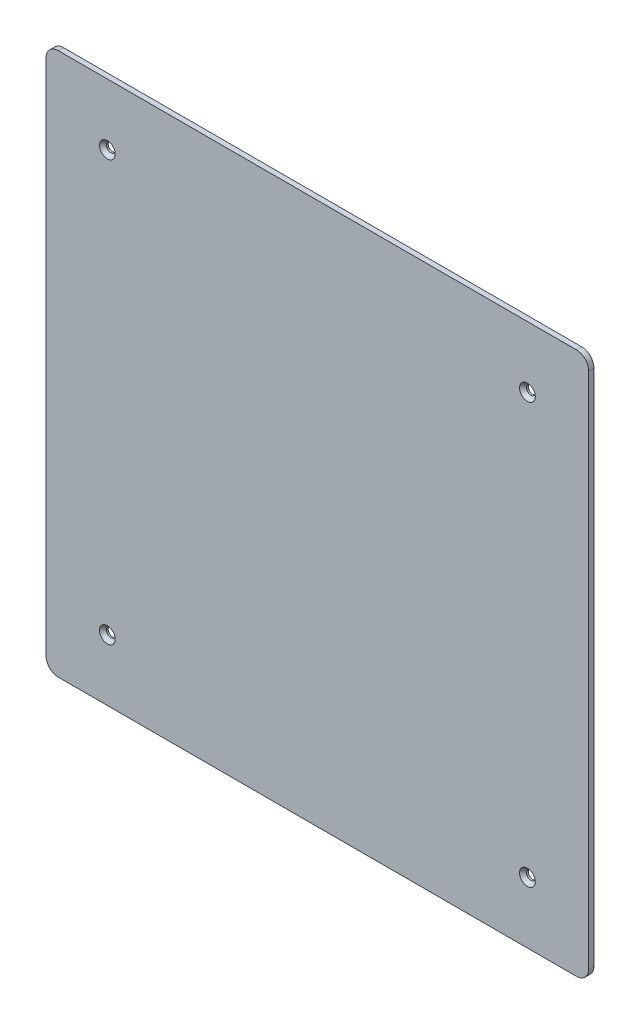
ISO-10303-21;
HEADER;
FILE_DESCRIPTION(('STEP AP214'),'2;1');
FILE_NAME('part.step','',(''),(''),'','','');
FILE_SCHEMA(('AUTOMOTIVE_DESIGN { 1 0 10303 214 1 1 1 1 }'));
ENDSEC;
DATA;
#1=APPLICATION_CONTEXT('core data for automotive mechanical design processes');
#2=APPLICATION_PROTOCOL_DEFINITION('international standard','automotive_design',2000,#1);
#3=PRODUCT_CONTEXT('',#1,'mechanical');
#4=PRODUCT('Part','Part','',(#3));
#5=PRODUCT_RELATED_PRODUCT_CATEGORY('part','',(#4));
#6=PRODUCT_DEFINITION_FORMATION('','',#4);
#7=PRODUCT_DEFINITION_CONTEXT('part definition',#1,'design');
#8=PRODUCT_DEFINITION('design','',#6,#7);
#9=PRODUCT_DEFINITION_SHAPE('','',#8);
#10=(LENGTH_UNIT() NAMED_UNIT(*) SI_UNIT(.MILLI.,.METRE.));
#11=(NAMED_UNIT(*) PLANE_ANGLE_UNIT() SI_UNIT($,.RADIAN.));
#12=(NAMED_UNIT(*) SI_UNIT($,.STERADIAN.) SOLID_ANGLE_UNIT());
#13=UNCERTAINTY_MEASURE_WITH_UNIT(LENGTH_MEASURE(1.E-05),#10,'distance_accuracy_value','');
#14=(GEOMETRIC_REPRESENTATION_CONTEXT(3) GLOBAL_UNCERTAINTY_ASSIGNED_CONTEXT((#13)) GLOBAL_UNIT_ASSIGNED_CONTEXT((#10,
#11,#12)) REPRESENTATION_CONTEXT('',''));
#15=CARTESIAN_POINT('',(0.,0.,0.));
#16=DIRECTION('',(0.,0.,1.));
#17=DIRECTION('',(1.,0.,0.));
#18=AXIS2_PLACEMENT_3D('',#15,#16,#17);
#19=CARTESIAN_POINT('',(-155.,155.,3.));
#20=DIRECTION('',(0.,-1.,0.));
#21=DIRECTION('',(1.,0.,0.));
#22=AXIS2_PLACEMENT_3D('',#19,#20,#21);
#23=PLANE('',#22);
#24=DIRECTION('',(-1.,0.,0.));
#25=VECTOR('',#24,1.);
#26=CARTESIAN_POINT('',(-155.,155.,0.));
#27=LINE('',#26,#25);
#28=CARTESIAN_POINT('',(148.,155.,0.));
#29=VERTEX_POINT('',#28);
#30=CARTESIAN_POINT('',(-148.,155.,0.));
#31=VERTEX_POINT('',#30);
#32=EDGE_CURVE('E274',#29,#31,#27,.T.);
#33=ORIENTED_EDGE('',*,*,#32,.T.);
#34=DIRECTION('',(0.,0.,-1.));
#35=VECTOR('',#34,1.);
#36=CARTESIAN_POINT('',(-148.,155.,3.));
#37=LINE('',#36,#35);
#38=CARTESIAN_POINT('',(-148.,155.,3.));
#39=VERTEX_POINT('',#38);
#40=EDGE_CURVE('E172',#31,#39,#37,.F.);
#41=ORIENTED_EDGE('',*,*,#40,.T.);
#42=DIRECTION('',(-1.,0.,0.));
#43=VECTOR('',#42,1.);
#44=CARTESIAN_POINT('',(-155.,155.,3.));
#45=LINE('',#44,#43);
#46=CARTESIAN_POINT('',(148.,155.,3.));
#47=VERTEX_POINT('',#46);
#48=EDGE_CURVE('E141',#47,#39,#45,.T.);
#49=ORIENTED_EDGE('',*,*,#48,.F.);
#50=DIRECTION('',(0.,0.,-1.));
#51=VECTOR('',#50,1.);
#52=CARTESIAN_POINT('',(148.,155.,3.));
#53=LINE('',#52,#51);
#54=EDGE_CURVE('E169',#47,#29,#53,.T.);
#55=ORIENTED_EDGE('',*,*,#54,.T.);
#56=EDGE_LOOP('',(#33,#41,#49,#55));
#57=FACE_BOUND('',#56,.T.);
#58=ADVANCED_FACE('F47',(#57),#23,.F.);
#59=CARTESIAN_POINT('',(-155.,-155.,3.));
#60=DIRECTION('',(1.,0.,0.));
#61=DIRECTION('',(0.,0.,-1.));
#62=AXIS2_PLACEMENT_3D('',#59,#60,#61);
#63=PLANE('',#62);
#64=DIRECTION('',(0.,-1.,0.));
#65=VECTOR('',#64,1.);
#66=CARTESIAN_POINT('',(-155.,-155.,0.));
#67=LINE('',#66,#65);
#68=CARTESIAN_POINT('',(-155.,148.,0.));
#69=VERTEX_POINT('',#68);
#70=CARTESIAN_POINT('',(-155.,-148.,0.));
#71=VERTEX_POINT('',#70);
#72=EDGE_CURVE('E146',#69,#71,#67,.T.);
#73=ORIENTED_EDGE('',*,*,#72,.T.);
#74=DIRECTION('',(0.,0.,-1.));
#75=VECTOR('',#74,1.);
#76=CARTESIAN_POINT('',(-155.,-148.,3.));
#77=LINE('',#76,#75);
#78=CARTESIAN_POINT('',(-155.,-148.,3.));
#79=VERTEX_POINT('',#78);
#80=EDGE_CURVE('E63',#71,#79,#77,.F.);
#81=ORIENTED_EDGE('',*,*,#80,.T.);
#82=DIRECTION('',(0.,-1.,0.));
#83=VECTOR('',#82,1.);
#84=CARTESIAN_POINT('',(-155.,-155.,3.));
#85=LINE('',#84,#83);
#86=CARTESIAN_POINT('',(-155.,148.,3.));
#87=VERTEX_POINT('',#86);
#88=EDGE_CURVE('E144',#87,#79,#85,.T.);
#89=ORIENTED_EDGE('',*,*,#88,.F.);
#90=DIRECTION('',(0.,0.,-1.));
#91=VECTOR('',#90,1.);
#92=CARTESIAN_POINT('',(-155.,148.,3.));
#93=LINE('',#92,#91);
#94=EDGE_CURVE('E165',#87,#69,#93,.T.);
#95=ORIENTED_EDGE('',*,*,#94,.T.);
#96=EDGE_LOOP('',(#73,#81,#89,#95));
#97=FACE_BOUND('',#96,.T.);
#98=ADVANCED_FACE('F212',(#97),#63,.F.);
#99=CARTESIAN_POINT('',(-155.,-155.,3.));
#100=DIRECTION('',(0.,1.,0.));
#101=DIRECTION('',(-1.,0.,0.));
#102=AXIS2_PLACEMENT_3D('',#99,#100,#101);
#103=PLANE('',#102);
#104=DIRECTION('',(1.,0.,0.));
#105=VECTOR('',#104,1.);
#106=CARTESIAN_POINT('',(-155.,-155.,0.));
#107=LINE('',#106,#105);
#108=CARTESIAN_POINT('',(-148.,-155.,0.));
#109=VERTEX_POINT('',#108);
#110=CARTESIAN_POINT('',(148.,-155.,0.));
#111=VERTEX_POINT('',#110);
#112=EDGE_CURVE('E142',#109,#111,#107,.T.);
#113=ORIENTED_EDGE('',*,*,#112,.T.);
#114=DIRECTION('',(0.,0.,-1.));
#115=VECTOR('',#114,1.);
#116=CARTESIAN_POINT('',(148.,-155.,3.));
#117=LINE('',#116,#115);
#118=CARTESIAN_POINT('',(148.,-155.,3.));
#119=VERTEX_POINT('',#118);
#120=EDGE_CURVE('E120',#111,#119,#117,.F.);
#121=ORIENTED_EDGE('',*,*,#120,.T.);
#122=DIRECTION('',(1.,0.,0.));
#123=VECTOR('',#122,1.);
#124=CARTESIAN_POINT('',(-155.,-155.,3.));
#125=LINE('',#124,#123);
#126=CARTESIAN_POINT('',(-148.,-155.,3.));
#127=VERTEX_POINT('',#126);
#128=EDGE_CURVE('E277',#127,#119,#125,.T.);
#129=ORIENTED_EDGE('',*,*,#128,.F.);
#130=DIRECTION('',(0.,0.,-1.));
#131=VECTOR('',#130,1.);
#132=CARTESIAN_POINT('',(-148.,-155.,3.));
#133=LINE('',#132,#131);
#134=EDGE_CURVE('E125',#127,#109,#133,.T.);
#135=ORIENTED_EDGE('',*,*,#134,.T.);
#136=EDGE_LOOP('',(#113,#121,#129,#135));
#137=FACE_BOUND('',#136,.T.);
#138=ADVANCED_FACE('F218',(#137),#103,.F.);
#139=CARTESIAN_POINT('',(155.,-155.,3.));
#140=DIRECTION('',(-1.,0.,0.));
#141=DIRECTION('',(0.,0.,1.));
#142=AXIS2_PLACEMENT_3D('',#139,#140,#141);
#143=PLANE('',#142);
#144=DIRECTION('',(0.,1.,0.));
#145=VECTOR('',#144,1.);
#146=CARTESIAN_POINT('',(155.,-155.,3.));
#147=LINE('',#146,#145);
#148=CARTESIAN_POINT('',(155.,-148.,3.));
#149=VERTEX_POINT('',#148);
#150=CARTESIAN_POINT('',(155.,148.,3.));
#151=VERTEX_POINT('',#150);
#152=EDGE_CURVE('E135',#149,#151,#147,.T.);
#153=ORIENTED_EDGE('',*,*,#152,.F.);
#154=DIRECTION('',(0.,0.,-1.));
#155=VECTOR('',#154,1.);
#156=CARTESIAN_POINT('',(155.,-148.,3.));
#157=LINE('',#156,#155);
#158=CARTESIAN_POINT('',(155.,-148.,0.));
#159=VERTEX_POINT('',#158);
#160=EDGE_CURVE('E119',#149,#159,#157,.T.);
#161=ORIENTED_EDGE('',*,*,#160,.T.);
#162=DIRECTION('',(0.,1.,0.));
#163=VECTOR('',#162,1.);
#164=CARTESIAN_POINT('',(155.,-155.,0.));
#165=LINE('',#164,#163);
#166=CARTESIAN_POINT('',(155.,148.,0.));
#167=VERTEX_POINT('',#166);
#168=EDGE_CURVE('E132',#159,#167,#165,.T.);
#169=ORIENTED_EDGE('',*,*,#168,.T.);
#170=DIRECTION('',(0.,0.,-1.));
#171=VECTOR('',#170,1.);
#172=CARTESIAN_POINT('',(155.,148.,3.));
#173=LINE('',#172,#171);
#174=EDGE_CURVE('E137',#167,#151,#173,.F.);
#175=ORIENTED_EDGE('',*,*,#174,.T.);
#176=EDGE_LOOP('',(#153,#161,#169,#175));
#177=FACE_BOUND('',#176,.T.);
#178=ADVANCED_FACE('F131',(#177),#143,.F.);
#179=CARTESIAN_POINT('',(0.,0.,3.));
#180=DIRECTION('',(0.,0.,1.));
#181=DIRECTION('',(1.,0.,0.));
#182=AXIS2_PLACEMENT_3D('',#179,#180,#181);
#183=PLANE('',#182);
#184=CARTESIAN_POINT('',(-120.,-120.,3.));
#185=DIRECTION('',(0.,0.,1.));
#186=DIRECTION('',(1.,0.,0.));
#187=AXIS2_PLACEMENT_3D('',#184,#185,#186);
#188=CIRCLE('',#187,4.50000000000013);
#189=CARTESIAN_POINT('',(-115.5,-120.,3.));
#190=VERTEX_POINT('',#189);
#191=EDGE_CURVE('E186',#190,#190,#188,.F.);
#192=ORIENTED_EDGE('',*,*,#191,.T.);
#193=EDGE_LOOP('',(#192));
#194=FACE_BOUND('',#193,.T.);
#195=CARTESIAN_POINT('',(120.,-120.,3.));
#196=DIRECTION('',(0.,0.,1.));
#197=DIRECTION('',(1.,0.,0.));
#198=AXIS2_PLACEMENT_3D('',#195,#196,#197);
#199=CIRCLE('',#198,4.50000000000002);
#200=CARTESIAN_POINT('',(124.5,-120.,3.));
#201=VERTEX_POINT('',#200);
#202=EDGE_CURVE('E183',#201,#201,#199,.F.);
#203=ORIENTED_EDGE('',*,*,#202,.T.);
#204=EDGE_LOOP('',(#203));
#205=FACE_BOUND('',#204,.T.);
#206=CARTESIAN_POINT('',(120.,120.,3.));
#207=DIRECTION('',(0.,0.,1.));
#208=DIRECTION('',(1.,0.,0.));
#209=AXIS2_PLACEMENT_3D('',#206,#207,#208);
#210=CIRCLE('',#209,4.50000000000002);
#211=CARTESIAN_POINT('',(124.5,120.,3.));
#212=VERTEX_POINT('',#211);
#213=EDGE_CURVE('E180',#212,#212,#210,.F.);
#214=ORIENTED_EDGE('',*,*,#213,.T.);
#215=EDGE_LOOP('',(#214));
#216=FACE_BOUND('',#215,.T.);
#217=CARTESIAN_POINT('',(-120.,120.,3.));
#218=DIRECTION('',(0.,0.,1.));
#219=DIRECTION('',(1.,0.,0.));
#220=AXIS2_PLACEMENT_3D('',#217,#218,#219);
#221=CIRCLE('',#220,4.50000000000002);
#222=CARTESIAN_POINT('',(-115.5,120.,3.));
#223=VERTEX_POINT('',#222);
#224=EDGE_CURVE('E177',#223,#223,#221,.F.);
#225=ORIENTED_EDGE('',*,*,#224,.T.);
#226=EDGE_LOOP('',(#225));
#227=FACE_BOUND('',#226,.T.);
#228=ORIENTED_EDGE('',*,*,#128,.T.);
#229=CARTESIAN_POINT('',(148.,-148.,3.));
#230=DIRECTION('',(0.,0.,1.));
#231=DIRECTION('',(1.,0.,0.));
#232=AXIS2_PLACEMENT_3D('',#229,#230,#231);
#233=CIRCLE('',#232,7.);
#234=EDGE_CURVE('E163',#119,#149,#233,.T.);
#235=ORIENTED_EDGE('',*,*,#234,.T.);
#236=ORIENTED_EDGE('',*,*,#152,.T.);
#237=CARTESIAN_POINT('',(148.,148.,3.));
#238=DIRECTION('',(0.,0.,1.));
#239=DIRECTION('',(1.,0.,0.));
#240=AXIS2_PLACEMENT_3D('',#237,#238,#239);
#241=CIRCLE('',#240,7.);
#242=EDGE_CURVE('E158',#151,#47,#241,.T.);
#243=ORIENTED_EDGE('',*,*,#242,.T.);
#244=ORIENTED_EDGE('',*,*,#48,.T.);
#245=CARTESIAN_POINT('',(-148.,148.,3.));
#246=DIRECTION('',(0.,0.,1.));
#247=DIRECTION('',(1.,0.,0.));
#248=AXIS2_PLACEMENT_3D('',#245,#246,#247);
#249=CIRCLE('',#248,7.);
#250=EDGE_CURVE('E70',#39,#87,#249,.T.);
#251=ORIENTED_EDGE('',*,*,#250,.T.);
#252=ORIENTED_EDGE('',*,*,#88,.T.);
#253=CARTESIAN_POINT('',(-148.,-148.,3.));
#254=DIRECTION('',(0.,0.,1.));
#255=DIRECTION('',(1.,0.,0.));
#256=AXIS2_PLACEMENT_3D('',#253,#254,#255);
#257=CIRCLE('',#256,7.);
#258=EDGE_CURVE('E161',#79,#127,#257,.T.);
#259=ORIENTED_EDGE('',*,*,#258,.T.);
#260=EDGE_LOOP('',(#228,#235,#236,#243,#244,#251,#252,#259));
#261=FACE_BOUND('',#260,.T.);
#262=ADVANCED_FACE('F286',(#194,#205,#216,#227,#261),#183,.T.);
#263=CARTESIAN_POINT('',(0.,0.,0.));
#264=DIRECTION('',(0.,0.,1.));
#265=DIRECTION('',(1.,0.,0.));
#266=AXIS2_PLACEMENT_3D('',#263,#264,#265);
#267=PLANE('',#266);
#268=CARTESIAN_POINT('',(-120.,-120.,0.));
#269=DIRECTION('',(0.,0.,1.));
#270=DIRECTION('',(1.,0.,0.));
#271=AXIS2_PLACEMENT_3D('',#268,#269,#270);
#272=CIRCLE('',#271,2.50000000000001);
#273=CARTESIAN_POINT('',(-117.5,-120.,0.));
#274=VERTEX_POINT('',#273);
#275=EDGE_CURVE('E263',#274,#274,#272,.T.);
#276=ORIENTED_EDGE('',*,*,#275,.T.);
#277=EDGE_LOOP('',(#276));
#278=FACE_BOUND('',#277,.T.);
#279=CARTESIAN_POINT('',(120.,-120.,0.));
#280=DIRECTION('',(0.,0.,1.));
#281=DIRECTION('',(1.,0.,0.));
#282=AXIS2_PLACEMENT_3D('',#279,#280,#281);
#283=CIRCLE('',#282,2.50000000000001);
#284=CARTESIAN_POINT('',(122.5,-120.,0.));
#285=VERTEX_POINT('',#284);
#286=EDGE_CURVE('E265',#285,#285,#283,.T.);
#287=ORIENTED_EDGE('',*,*,#286,.T.);
#288=EDGE_LOOP('',(#287));
#289=FACE_BOUND('',#288,.T.);
#290=CARTESIAN_POINT('',(120.,120.,0.));
#291=DIRECTION('',(0.,0.,1.));
#292=DIRECTION('',(1.,0.,0.));
#293=AXIS2_PLACEMENT_3D('',#290,#291,#292);
#294=CIRCLE('',#293,2.50000000000001);
#295=CARTESIAN_POINT('',(122.5,120.,0.));
#296=VERTEX_POINT('',#295);
#297=EDGE_CURVE('E268',#296,#296,#294,.T.);
#298=ORIENTED_EDGE('',*,*,#297,.T.);
#299=EDGE_LOOP('',(#298));
#300=FACE_BOUND('',#299,.T.);
#301=CARTESIAN_POINT('',(-120.,120.,0.));
#302=DIRECTION('',(0.,0.,1.));
#303=DIRECTION('',(1.,0.,0.));
#304=AXIS2_PLACEMENT_3D('',#301,#302,#303);
#305=CIRCLE('',#304,2.50000000000001);
#306=CARTESIAN_POINT('',(-117.5,120.,0.));
#307=VERTEX_POINT('',#306);
#308=EDGE_CURVE('E272',#307,#307,#305,.T.);
#309=ORIENTED_EDGE('',*,*,#308,.T.);
#310=EDGE_LOOP('',(#309));
#311=FACE_BOUND('',#310,.T.);
#312=ORIENTED_EDGE('',*,*,#168,.F.);
#313=CARTESIAN_POINT('',(148.,-148.,0.));
#314=DIRECTION('',(0.,0.,1.));
#315=DIRECTION('',(1.,0.,0.));
#316=AXIS2_PLACEMENT_3D('',#313,#314,#315);
#317=CIRCLE('',#316,7.);
#318=EDGE_CURVE('E115',#159,#111,#317,.F.);
#319=ORIENTED_EDGE('',*,*,#318,.T.);
#320=ORIENTED_EDGE('',*,*,#112,.F.);
#321=CARTESIAN_POINT('',(-148.,-148.,0.));
#322=DIRECTION('',(0.,0.,1.));
#323=DIRECTION('',(1.,0.,0.));
#324=AXIS2_PLACEMENT_3D('',#321,#322,#323);
#325=CIRCLE('',#324,7.);
#326=EDGE_CURVE('E126',#109,#71,#325,.F.);
#327=ORIENTED_EDGE('',*,*,#326,.T.);
#328=ORIENTED_EDGE('',*,*,#72,.F.);
#329=CARTESIAN_POINT('',(-148.,148.,0.));
#330=DIRECTION('',(0.,0.,1.));
#331=DIRECTION('',(1.,0.,0.));
#332=AXIS2_PLACEMENT_3D('',#329,#330,#331);
#333=CIRCLE('',#332,7.);
#334=EDGE_CURVE('E152',#69,#31,#333,.F.);
#335=ORIENTED_EDGE('',*,*,#334,.T.);
#336=ORIENTED_EDGE('',*,*,#32,.F.);
#337=CARTESIAN_POINT('',(148.,148.,0.));
#338=DIRECTION('',(0.,0.,1.));
#339=DIRECTION('',(1.,0.,0.));
#340=AXIS2_PLACEMENT_3D('',#337,#338,#339);
#341=CIRCLE('',#340,7.);
#342=EDGE_CURVE('E136',#29,#167,#341,.F.);
#343=ORIENTED_EDGE('',*,*,#342,.T.);
#344=EDGE_LOOP('',(#312,#319,#320,#327,#328,#335,#336,#343));
#345=FACE_BOUND('',#344,.T.);
#346=ADVANCED_FACE('F139',(#278,#289,#300,#311,#345),#267,.F.);
#347=CARTESIAN_POINT('',(148.,-148.,3.));
#348=DIRECTION('',(0.,0.,-1.));
#349=DIRECTION('',(-1.,0.,0.));
#350=AXIS2_PLACEMENT_3D('',#347,#348,#349);
#351=CYLINDRICAL_SURFACE('',#350,7.);
#352=ORIENTED_EDGE('',*,*,#234,.F.);
#353=ORIENTED_EDGE('',*,*,#120,.F.);
#354=ORIENTED_EDGE('',*,*,#318,.F.);
#355=ORIENTED_EDGE('',*,*,#160,.F.);
#356=EDGE_LOOP('',(#352,#353,#354,#355));
#357=FACE_BOUND('',#356,.T.);
#358=ADVANCED_FACE('F118',(#357),#351,.T.);
#359=CARTESIAN_POINT('',(-148.,-148.,3.));
#360=DIRECTION('',(0.,0.,-1.));
#361=DIRECTION('',(-1.,0.,0.));
#362=AXIS2_PLACEMENT_3D('',#359,#360,#361);
#363=CYLINDRICAL_SURFACE('',#362,7.);
#364=ORIENTED_EDGE('',*,*,#258,.F.);
#365=ORIENTED_EDGE('',*,*,#80,.F.);
#366=ORIENTED_EDGE('',*,*,#326,.F.);
#367=ORIENTED_EDGE('',*,*,#134,.F.);
#368=EDGE_LOOP('',(#364,#365,#366,#367));
#369=FACE_BOUND('',#368,.T.);
#370=ADVANCED_FACE('F225',(#369),#363,.T.);
#371=CARTESIAN_POINT('',(-148.,148.,3.));
#372=DIRECTION('',(0.,0.,-1.));
#373=DIRECTION('',(-1.,0.,0.));
#374=AXIS2_PLACEMENT_3D('',#371,#372,#373);
#375=CYLINDRICAL_SURFACE('',#374,7.);
#376=ORIENTED_EDGE('',*,*,#250,.F.);
#377=ORIENTED_EDGE('',*,*,#40,.F.);
#378=ORIENTED_EDGE('',*,*,#334,.F.);
#379=ORIENTED_EDGE('',*,*,#94,.F.);
#380=EDGE_LOOP('',(#376,#377,#378,#379));
#381=FACE_BOUND('',#380,.T.);
#382=ADVANCED_FACE('F228',(#381),#375,.T.);
#383=CARTESIAN_POINT('',(148.,148.,3.));
#384=DIRECTION('',(0.,0.,-1.));
#385=DIRECTION('',(-1.,0.,0.));
#386=AXIS2_PLACEMENT_3D('',#383,#384,#385);
#387=CYLINDRICAL_SURFACE('',#386,7.);
#388=ORIENTED_EDGE('',*,*,#242,.F.);
#389=ORIENTED_EDGE('',*,*,#174,.F.);
#390=ORIENTED_EDGE('',*,*,#342,.F.);
#391=ORIENTED_EDGE('',*,*,#54,.F.);
#392=EDGE_LOOP('',(#388,#389,#390,#391));
#393=FACE_BOUND('',#392,.T.);
#394=ADVANCED_FACE('F232',(#393),#387,.T.);
#395=CARTESIAN_POINT('',(-120.,120.,0.));
#396=DIRECTION('',(0.,0.,1.));
#397=DIRECTION('',(1.,0.,0.));
#398=AXIS2_PLACEMENT_3D('',#395,#396,#397);
#399=CYLINDRICAL_SURFACE('',#398,2.50000000000001);
#400=CARTESIAN_POINT('',(-120.,120.,1.00000000000005));
#401=DIRECTION('',(0.,0.,1.));
#402=DIRECTION('',(1.,0.,0.));
#403=AXIS2_PLACEMENT_3D('',#400,#401,#402);
#404=CIRCLE('',#403,2.50000000000001);
#405=CARTESIAN_POINT('',(-117.5,120.,1.00000000000005));
#406=VERTEX_POINT('',#405);
#407=EDGE_CURVE('E11',#406,#406,#404,.T.);
#408=ORIENTED_EDGE('',*,*,#407,.T.);
#409=EDGE_LOOP('',(#408));
#410=FACE_BOUND('',#409,.T.);
#411=ORIENTED_EDGE('',*,*,#308,.F.);
#412=EDGE_LOOP('',(#411));
#413=FACE_BOUND('',#412,.T.);
#414=ADVANCED_FACE('F236',(#410,#413),#399,.F.);
#415=CARTESIAN_POINT('',(120.,120.,0.));
#416=DIRECTION('',(0.,0.,1.));
#417=DIRECTION('',(1.,0.,0.));
#418=AXIS2_PLACEMENT_3D('',#415,#416,#417);
#419=CYLINDRICAL_SURFACE('',#418,2.50000000000001);
#420=CARTESIAN_POINT('',(120.,120.,1.00000000000005));
#421=DIRECTION('',(0.,0.,1.));
#422=DIRECTION('',(1.,0.,0.));
#423=AXIS2_PLACEMENT_3D('',#420,#421,#422);
#424=CIRCLE('',#423,2.50000000000001);
#425=CARTESIAN_POINT('',(122.5,120.,1.00000000000005));
#426=VERTEX_POINT('',#425);
#427=EDGE_CURVE('E56',#426,#426,#424,.T.);
#428=ORIENTED_EDGE('',*,*,#427,.T.);
#429=EDGE_LOOP('',(#428));
#430=FACE_BOUND('',#429,.T.);
#431=ORIENTED_EDGE('',*,*,#297,.F.);
#432=EDGE_LOOP('',(#431));
#433=FACE_BOUND('',#432,.T.);
#434=ADVANCED_FACE('F194',(#430,#433),#419,.F.);
#435=CARTESIAN_POINT('',(120.,-120.,0.));
#436=DIRECTION('',(0.,0.,1.));
#437=DIRECTION('',(1.,0.,0.));
#438=AXIS2_PLACEMENT_3D('',#435,#436,#437);
#439=CYLINDRICAL_SURFACE('',#438,2.50000000000001);
#440=CARTESIAN_POINT('',(120.,-120.,1.00000000000005));
#441=DIRECTION('',(0.,0.,1.));
#442=DIRECTION('',(1.,0.,0.));
#443=AXIS2_PLACEMENT_3D('',#440,#441,#442);
#444=CIRCLE('',#443,2.50000000000001);
#445=CARTESIAN_POINT('',(122.5,-120.,1.00000000000005));
#446=VERTEX_POINT('',#445);
#447=EDGE_CURVE('E189',#446,#446,#444,.T.);
#448=ORIENTED_EDGE('',*,*,#447,.T.);
#449=EDGE_LOOP('',(#448));
#450=FACE_BOUND('',#449,.T.);
#451=ORIENTED_EDGE('',*,*,#286,.F.);
#452=EDGE_LOOP('',(#451));
#453=FACE_BOUND('',#452,.T.);
#454=ADVANCED_FACE('F254',(#450,#453),#439,.F.);
#455=CARTESIAN_POINT('',(-120.,-120.,0.));
#456=DIRECTION('',(0.,0.,1.));
#457=DIRECTION('',(1.,0.,0.));
#458=AXIS2_PLACEMENT_3D('',#455,#456,#457);
#459=CYLINDRICAL_SURFACE('',#458,2.50000000000001);
#460=CARTESIAN_POINT('',(-120.,-120.,0.999999999999886));
#461=DIRECTION('',(0.,0.,1.));
#462=DIRECTION('',(1.,0.,0.));
#463=AXIS2_PLACEMENT_3D('',#460,#461,#462);
#464=CIRCLE('',#463,2.50000000000001);
#465=CARTESIAN_POINT('',(-117.5,-120.,0.999999999999886));
#466=VERTEX_POINT('',#465);
#467=EDGE_CURVE('E174',#466,#466,#464,.T.);
#468=ORIENTED_EDGE('',*,*,#467,.T.);
#469=EDGE_LOOP('',(#468));
#470=FACE_BOUND('',#469,.T.);
#471=ORIENTED_EDGE('',*,*,#275,.F.);
#472=EDGE_LOOP('',(#471));
#473=FACE_BOUND('',#472,.T.);
#474=ADVANCED_FACE('F243',(#470,#473),#459,.F.);
#475=CARTESIAN_POINT('',(-120.,-120.,0.999999999999886));
#476=DIRECTION('',(0.,0.,1.));
#477=DIRECTION('',(1.,0.,0.));
#478=AXIS2_PLACEMENT_3D('',#475,#476,#477);
#479=CONICAL_SURFACE('',#478,2.50000000000001,0.78539816339745);
#480=ORIENTED_EDGE('',*,*,#191,.F.);
#481=EDGE_LOOP('',(#480));
#482=FACE_BOUND('',#481,.T.);
#483=ORIENTED_EDGE('',*,*,#467,.F.);
#484=EDGE_LOOP('',(#483));
#485=FACE_BOUND('',#484,.T.);
#486=ADVANCED_FACE('F206',(#482,#485),#479,.F.);
#487=CARTESIAN_POINT('',(120.,-120.,1.00000000000005));
#488=DIRECTION('',(0.,0.,1.));
#489=DIRECTION('',(1.,0.,0.));
#490=AXIS2_PLACEMENT_3D('',#487,#488,#489);
#491=CONICAL_SURFACE('',#490,2.50000000000001,0.785398163397463);
#492=ORIENTED_EDGE('',*,*,#202,.F.);
#493=EDGE_LOOP('',(#492));
#494=FACE_BOUND('',#493,.T.);
#495=ORIENTED_EDGE('',*,*,#447,.F.);
#496=EDGE_LOOP('',(#495));
#497=FACE_BOUND('',#496,.T.);
#498=ADVANCED_FACE('F199',(#494,#497),#491,.F.);
#499=CARTESIAN_POINT('',(120.,120.,1.00000000000005));
#500=DIRECTION('',(0.,0.,1.));
#501=DIRECTION('',(1.,0.,0.));
#502=AXIS2_PLACEMENT_3D('',#499,#500,#501);
#503=CONICAL_SURFACE('',#502,2.50000000000001,0.785398163397463);
#504=ORIENTED_EDGE('',*,*,#213,.F.);
#505=EDGE_LOOP('',(#504));
#506=FACE_BOUND('',#505,.T.);
#507=ORIENTED_EDGE('',*,*,#427,.F.);
#508=EDGE_LOOP('',(#507));
#509=FACE_BOUND('',#508,.T.);
#510=ADVANCED_FACE('F197',(#506,#509),#503,.F.);
#511=CARTESIAN_POINT('',(-120.,120.,1.00000000000005));
#512=DIRECTION('',(0.,0.,1.));
#513=DIRECTION('',(1.,0.,0.));
#514=AXIS2_PLACEMENT_3D('',#511,#512,#513);
#515=CONICAL_SURFACE('',#514,2.50000000000001,0.785398163397463);
#516=ORIENTED_EDGE('',*,*,#224,.F.);
#517=EDGE_LOOP('',(#516));
#518=FACE_BOUND('',#517,.T.);
#519=ORIENTED_EDGE('',*,*,#407,.F.);
#520=EDGE_LOOP('',(#519));
#521=FACE_BOUND('',#520,.T.);
#522=ADVANCED_FACE('F50',(#518,#521),#515,.F.);
#523=CLOSED_SHELL('',(#58,#98,#138,#178,#262,#346,#358,#370,#382,#394,#414,#434,#454,#474,#486,
#498,#510,#522));
#524=MANIFOLD_SOLID_BREP('B2',#523);
#525=ADVANCED_BREP_SHAPE_REPRESENTATION('',(#18,#524),#14);
#526=SHAPE_DEFINITION_REPRESENTATION(#9,#525);
ENDSEC;
END-ISO-10303-21;
